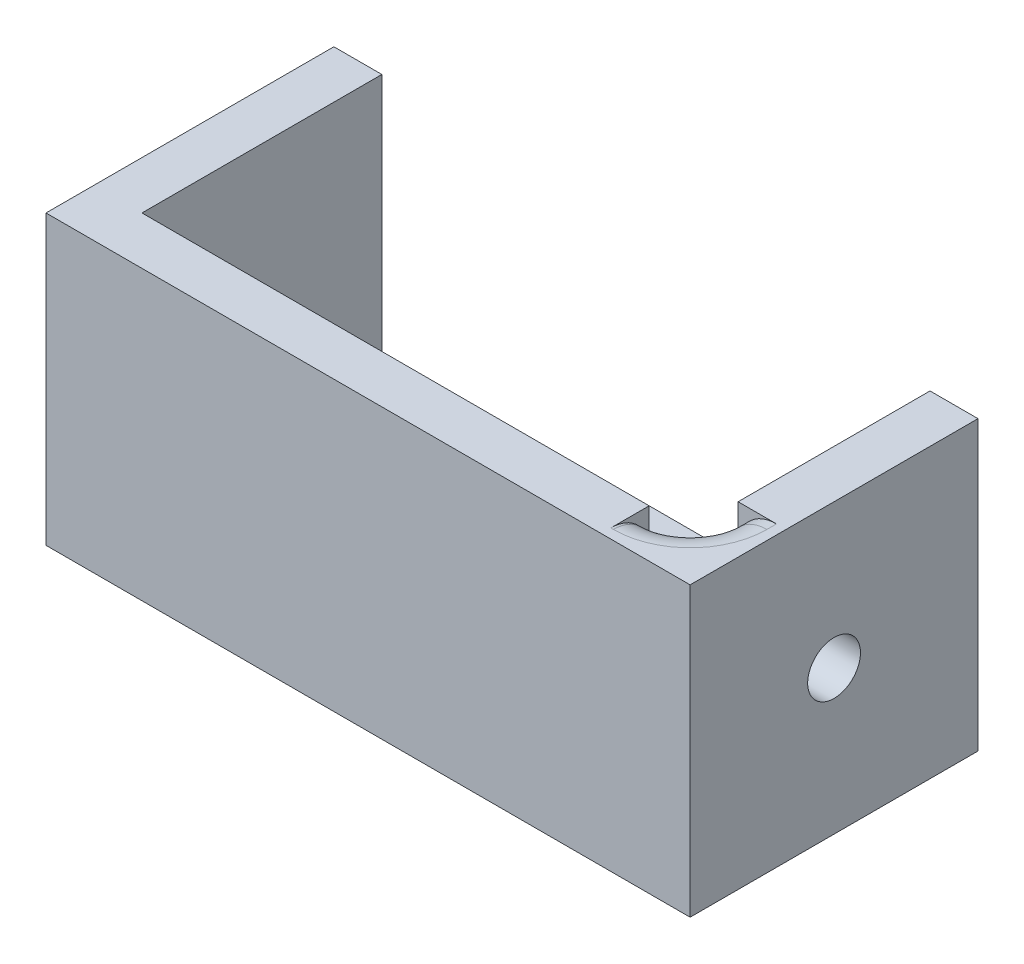
ISO-10303-21;
HEADER;
FILE_DESCRIPTION(('STEP AP214'),'2;1');
FILE_NAME('part.step','',(''),(''),'','','');
FILE_SCHEMA(('AUTOMOTIVE_DESIGN { 1 0 10303 214 1 1 1 1 }'));
ENDSEC;
DATA;
#1=APPLICATION_CONTEXT('core data for automotive mechanical design processes');
#2=APPLICATION_PROTOCOL_DEFINITION('international standard','automotive_design',2000,#1);
#3=PRODUCT_CONTEXT('',#1,'mechanical');
#4=PRODUCT('Part','Part','',(#3));
#5=PRODUCT_RELATED_PRODUCT_CATEGORY('part','',(#4));
#6=PRODUCT_DEFINITION_FORMATION('','',#4);
#7=PRODUCT_DEFINITION_CONTEXT('part definition',#1,'design');
#8=PRODUCT_DEFINITION('design','',#6,#7);
#9=PRODUCT_DEFINITION_SHAPE('','',#8);
#10=(LENGTH_UNIT() NAMED_UNIT(*) SI_UNIT(.MILLI.,.METRE.));
#11=(NAMED_UNIT(*) PLANE_ANGLE_UNIT() SI_UNIT($,.RADIAN.));
#12=(NAMED_UNIT(*) SI_UNIT($,.STERADIAN.) SOLID_ANGLE_UNIT());
#13=UNCERTAINTY_MEASURE_WITH_UNIT(LENGTH_MEASURE(1.E-05),#10,'distance_accuracy_value','');
#14=(GEOMETRIC_REPRESENTATION_CONTEXT(3) GLOBAL_UNCERTAINTY_ASSIGNED_CONTEXT((#13)) GLOBAL_UNIT_ASSIGNED_CONTEXT((#10,
#11,#12)) REPRESENTATION_CONTEXT('',''));
#15=CARTESIAN_POINT('',(0.,0.,0.));
#16=DIRECTION('',(0.,0.,1.));
#17=DIRECTION('',(1.,0.,0.));
#18=AXIS2_PLACEMENT_3D('',#15,#16,#17);
#19=CARTESIAN_POINT('',(-33.5625,15.,30.));
#20=DIRECTION('',(1.,0.,0.));
#21=DIRECTION('',(0.,0.,-1.));
#22=AXIS2_PLACEMENT_3D('',#19,#20,#21);
#23=PLANE('',#22);
#24=CARTESIAN_POINT('',(-33.5625,0.,15.));
#25=DIRECTION('',(1.,0.,0.));
#26=DIRECTION('',(0.,0.,-1.));
#27=AXIS2_PLACEMENT_3D('',#24,#25,#26);
#28=CIRCLE('',#27,2.75);
#29=CARTESIAN_POINT('',(-33.5625,0.,12.25));
#30=VERTEX_POINT('',#29);
#31=EDGE_CURVE('E272',#30,#30,#28,.T.);
#32=ORIENTED_EDGE('',*,*,#31,.T.);
#33=EDGE_LOOP('',(#32));
#34=FACE_BOUND('',#33,.T.);
#35=DIRECTION('',(0.,-1.,0.));
#36=VECTOR('',#35,1.);
#37=CARTESIAN_POINT('',(-33.5625,15.,0.));
#38=LINE('',#37,#36);
#39=CARTESIAN_POINT('',(-33.5625,15.,0.));
#40=VERTEX_POINT('',#39);
#41=CARTESIAN_POINT('',(-33.5625,-15.,0.));
#42=VERTEX_POINT('',#41);
#43=EDGE_CURVE('E219',#40,#42,#38,.T.);
#44=ORIENTED_EDGE('',*,*,#43,.T.);
#45=DIRECTION('',(0.,0.,-1.));
#46=VECTOR('',#45,1.);
#47=CARTESIAN_POINT('',(-33.5625,-15.,30.));
#48=LINE('',#47,#46);
#49=CARTESIAN_POINT('',(-33.5625,-15.,30.));
#50=VERTEX_POINT('',#49);
#51=EDGE_CURVE('E263',#50,#42,#48,.T.);
#52=ORIENTED_EDGE('',*,*,#51,.F.);
#53=DIRECTION('',(0.,-1.,0.));
#54=VECTOR('',#53,1.);
#55=CARTESIAN_POINT('',(-33.5625,15.,30.));
#56=LINE('',#55,#54);
#57=CARTESIAN_POINT('',(-33.5625,15.,30.));
#58=VERTEX_POINT('',#57);
#59=EDGE_CURVE('E224',#58,#50,#56,.T.);
#60=ORIENTED_EDGE('',*,*,#59,.F.);
#61=DIRECTION('',(0.,0.,-1.));
#62=VECTOR('',#61,1.);
#63=CARTESIAN_POINT('',(-33.5625,15.,30.));
#64=LINE('',#63,#62);
#65=EDGE_CURVE('E238',#58,#40,#64,.T.);
#66=ORIENTED_EDGE('',*,*,#65,.T.);
#67=EDGE_LOOP('',(#44,#52,#60,#66));
#68=FACE_BOUND('',#67,.T.);
#69=ADVANCED_FACE('F45',(#34,#68),#23,.F.);
#70=CARTESIAN_POINT('',(33.5625,-15.,30.));
#71=DIRECTION('',(0.,1.,0.));
#72=DIRECTION('',(0.,0.,1.));
#73=AXIS2_PLACEMENT_3D('',#70,#71,#72);
#74=PLANE('',#73);
#75=DIRECTION('',(1.,0.,0.));
#76=VECTOR('',#75,1.);
#77=CARTESIAN_POINT('',(33.5625,-15.,0.));
#78=LINE('',#77,#76);
#79=CARTESIAN_POINT('',(33.5625,-15.,0.));
#80=VERTEX_POINT('',#79);
#81=EDGE_CURVE('E242',#42,#80,#78,.T.);
#82=ORIENTED_EDGE('',*,*,#81,.T.);
#83=DIRECTION('',(0.,0.,-1.));
#84=VECTOR('',#83,1.);
#85=CARTESIAN_POINT('',(33.5625,-15.,30.));
#86=LINE('',#85,#84);
#87=CARTESIAN_POINT('',(33.5625,-15.,30.));
#88=VERTEX_POINT('',#87);
#89=EDGE_CURVE('E259',#88,#80,#86,.T.);
#90=ORIENTED_EDGE('',*,*,#89,.F.);
#91=DIRECTION('',(1.,0.,0.));
#92=VECTOR('',#91,1.);
#93=CARTESIAN_POINT('',(33.5625,-15.,30.));
#94=LINE('',#93,#92);
#95=EDGE_CURVE('E228',#50,#88,#94,.T.);
#96=ORIENTED_EDGE('',*,*,#95,.F.);
#97=ORIENTED_EDGE('',*,*,#51,.T.);
#98=EDGE_LOOP('',(#82,#90,#96,#97));
#99=FACE_BOUND('',#98,.T.);
#100=ADVANCED_FACE('F399',(#99),#74,.F.);
#101=CARTESIAN_POINT('',(33.5625,15.,30.));
#102=DIRECTION('',(-1.,0.,0.));
#103=DIRECTION('',(0.,0.,1.));
#104=AXIS2_PLACEMENT_3D('',#101,#102,#103);
#105=PLANE('',#104);
#106=CARTESIAN_POINT('',(33.5625,0.,15.));
#107=DIRECTION('',(1.,0.,0.));
#108=DIRECTION('',(0.,0.,-1.));
#109=AXIS2_PLACEMENT_3D('',#106,#107,#108);
#110=CIRCLE('',#109,2.75);
#111=CARTESIAN_POINT('',(33.5625,0.,12.25));
#112=VERTEX_POINT('',#111);
#113=EDGE_CURVE('E337',#112,#112,#110,.T.);
#114=ORIENTED_EDGE('',*,*,#113,.F.);
#115=EDGE_LOOP('',(#114));
#116=FACE_BOUND('',#115,.T.);
#117=DIRECTION('',(0.,1.,0.));
#118=VECTOR('',#117,1.);
#119=CARTESIAN_POINT('',(33.5625,15.,0.));
#120=LINE('',#119,#118);
#121=CARTESIAN_POINT('',(33.5625,15.,0.));
#122=VERTEX_POINT('',#121);
#123=EDGE_CURVE('E245',#80,#122,#120,.T.);
#124=ORIENTED_EDGE('',*,*,#123,.T.);
#125=DIRECTION('',(0.,0.,-1.));
#126=VECTOR('',#125,1.);
#127=CARTESIAN_POINT('',(33.5625,15.,30.));
#128=LINE('',#127,#126);
#129=CARTESIAN_POINT('',(33.5625,15.,30.));
#130=VERTEX_POINT('',#129);
#131=EDGE_CURVE('E255',#130,#122,#128,.T.);
#132=ORIENTED_EDGE('',*,*,#131,.F.);
#133=DIRECTION('',(0.,1.,0.));
#134=VECTOR('',#133,1.);
#135=CARTESIAN_POINT('',(33.5625,15.,30.));
#136=LINE('',#135,#134);
#137=EDGE_CURVE('E232',#88,#130,#136,.T.);
#138=ORIENTED_EDGE('',*,*,#137,.F.);
#139=ORIENTED_EDGE('',*,*,#89,.T.);
#140=EDGE_LOOP('',(#124,#132,#138,#139));
#141=FACE_BOUND('',#140,.T.);
#142=ADVANCED_FACE('F405',(#116,#141),#105,.F.);
#143=CARTESIAN_POINT('',(33.5625,15.,30.));
#144=DIRECTION('',(0.,-1.,0.));
#145=DIRECTION('',(0.,0.,-1.));
#146=AXIS2_PLACEMENT_3D('',#143,#144,#145);
#147=PLANE('',#146);
#148=DIRECTION('',(0.,0.,-1.));
#149=VECTOR('',#148,1.);
#150=CARTESIAN_POINT('',(28.5625,15.,25.));
#151=LINE('',#150,#149);
#152=CARTESIAN_POINT('',(28.5625,15.,20.));
#153=VERTEX_POINT('',#152);
#154=CARTESIAN_POINT('',(28.5625,15.,0.));
#155=VERTEX_POINT('',#154);
#156=EDGE_CURVE('E216',#153,#155,#151,.T.);
#157=ORIENTED_EDGE('',*,*,#156,.F.);
#158=DIRECTION('',(1.,0.,0.));
#159=VECTOR('',#158,1.);
#160=CARTESIAN_POINT('',(32.5625,15.,20.));
#161=LINE('',#160,#159);
#162=CARTESIAN_POINT('',(32.5625,15.,20.));
#163=VERTEX_POINT('',#162);
#164=EDGE_CURVE('E297',#153,#163,#161,.T.);
#165=ORIENTED_EDGE('',*,*,#164,.T.);
#166=DIRECTION('',(0.,0.,-1.));
#167=VECTOR('',#166,1.);
#168=CARTESIAN_POINT('',(32.5625,15.,30.));
#169=LINE('',#168,#167);
#170=CARTESIAN_POINT('',(32.5625,15.,21.));
#171=VERTEX_POINT('',#170);
#172=EDGE_CURVE('E294',#163,#171,#169,.F.);
#173=ORIENTED_EDGE('',*,*,#172,.T.);
#174=CARTESIAN_POINT('',(24.5625,15.,21.));
#175=DIRECTION('',(0.,-1.,0.));
#176=DIRECTION('',(0.,0.,-1.));
#177=AXIS2_PLACEMENT_3D('',#174,#175,#176);
#178=CIRCLE('',#177,8.);
#179=CARTESIAN_POINT('',(24.5625,15.,29.));
#180=VERTEX_POINT('',#179);
#181=EDGE_CURVE('E290',#180,#171,#178,.F.);
#182=ORIENTED_EDGE('',*,*,#181,.F.);
#183=DIRECTION('',(1.,0.,0.));
#184=VECTOR('',#183,1.);
#185=CARTESIAN_POINT('',(-28.5625,15.,29.));
#186=LINE('',#185,#184);
#187=CARTESIAN_POINT('',(24.29375,15.,29.));
#188=VERTEX_POINT('',#187);
#189=EDGE_CURVE('E287',#180,#188,#186,.F.);
#190=ORIENTED_EDGE('',*,*,#189,.T.);
#191=DIRECTION('',(0.,0.,-1.));
#192=VECTOR('',#191,1.);
#193=CARTESIAN_POINT('',(24.29375,15.,29.));
#194=LINE('',#193,#192);
#195=CARTESIAN_POINT('',(24.29375,15.,25.));
#196=VERTEX_POINT('',#195);
#197=EDGE_CURVE('E284',#188,#196,#194,.T.);
#198=ORIENTED_EDGE('',*,*,#197,.T.);
#199=DIRECTION('',(1.,0.,0.));
#200=VECTOR('',#199,1.);
#201=CARTESIAN_POINT('',(28.5625,15.,25.));
#202=LINE('',#201,#200);
#203=CARTESIAN_POINT('',(-28.5625,15.,25.));
#204=VERTEX_POINT('',#203);
#205=EDGE_CURVE('E200',#204,#196,#202,.T.);
#206=ORIENTED_EDGE('',*,*,#205,.F.);
#207=DIRECTION('',(0.,0.,-1.));
#208=VECTOR('',#207,1.);
#209=CARTESIAN_POINT('',(-28.5625,15.,25.));
#210=LINE('',#209,#208);
#211=CARTESIAN_POINT('',(-28.5625,15.,0.));
#212=VERTEX_POINT('',#211);
#213=EDGE_CURVE('E194',#204,#212,#210,.T.);
#214=ORIENTED_EDGE('',*,*,#213,.T.);
#215=DIRECTION('',(-1.,0.,0.));
#216=VECTOR('',#215,1.);
#217=CARTESIAN_POINT('',(33.5625,15.,0.));
#218=LINE('',#217,#216);
#219=EDGE_CURVE('E248',#212,#40,#218,.T.);
#220=ORIENTED_EDGE('',*,*,#219,.T.);
#221=ORIENTED_EDGE('',*,*,#65,.F.);
#222=DIRECTION('',(-1.,0.,0.));
#223=VECTOR('',#222,1.);
#224=CARTESIAN_POINT('',(33.5625,15.,30.));
#225=LINE('',#224,#223);
#226=EDGE_CURVE('E235',#130,#58,#225,.T.);
#227=ORIENTED_EDGE('',*,*,#226,.F.);
#228=ORIENTED_EDGE('',*,*,#131,.T.);
#229=EDGE_CURVE('E229',#122,#155,#218,.T.);
#230=ORIENTED_EDGE('',*,*,#229,.T.);
#231=EDGE_LOOP('',(#157,#165,#173,#182,#190,#198,#206,#214,#220,#221,#227,#228,#230));
#232=FACE_BOUND('',#231,.T.);
#233=ADVANCED_FACE('F633',(#232),#147,.F.);
#234=CARTESIAN_POINT('',(0.,0.,30.));
#235=DIRECTION('',(0.,0.,-1.));
#236=DIRECTION('',(-1.,0.,0.));
#237=AXIS2_PLACEMENT_3D('',#234,#235,#236);
#238=PLANE('',#237);
#239=ORIENTED_EDGE('',*,*,#59,.T.);
#240=ORIENTED_EDGE('',*,*,#95,.T.);
#241=ORIENTED_EDGE('',*,*,#137,.T.);
#242=ORIENTED_EDGE('',*,*,#226,.T.);
#243=EDGE_LOOP('',(#239,#240,#241,#242));
#244=FACE_BOUND('',#243,.T.);
#245=ADVANCED_FACE('F622',(#244),#238,.F.);
#246=CARTESIAN_POINT('',(0.,0.,0.));
#247=DIRECTION('',(0.,0.,-1.));
#248=DIRECTION('',(-1.,0.,0.));
#249=AXIS2_PLACEMENT_3D('',#246,#247,#248);
#250=PLANE('',#249);
#251=DIRECTION('',(0.,-1.,0.));
#252=VECTOR('',#251,1.);
#253=CARTESIAN_POINT('',(28.5625,15.,0.));
#254=LINE('',#253,#252);
#255=CARTESIAN_POINT('',(28.5625,-10.,0.));
#256=VERTEX_POINT('',#255);
#257=EDGE_CURVE('E206',#155,#256,#254,.T.);
#258=ORIENTED_EDGE('',*,*,#257,.F.);
#259=ORIENTED_EDGE('',*,*,#229,.F.);
#260=ORIENTED_EDGE('',*,*,#123,.F.);
#261=ORIENTED_EDGE('',*,*,#81,.F.);
#262=ORIENTED_EDGE('',*,*,#43,.F.);
#263=ORIENTED_EDGE('',*,*,#219,.F.);
#264=DIRECTION('',(0.,1.,0.));
#265=VECTOR('',#264,1.);
#266=CARTESIAN_POINT('',(-28.5625,15.,0.));
#267=LINE('',#266,#265);
#268=CARTESIAN_POINT('',(-28.5625,-10.,0.));
#269=VERTEX_POINT('',#268);
#270=EDGE_CURVE('E213',#269,#212,#267,.T.);
#271=ORIENTED_EDGE('',*,*,#270,.F.);
#272=DIRECTION('',(-1.,0.,0.));
#273=VECTOR('',#272,1.);
#274=CARTESIAN_POINT('',(28.5625,-10.,0.));
#275=LINE('',#274,#273);
#276=EDGE_CURVE('E190',#256,#269,#275,.T.);
#277=ORIENTED_EDGE('',*,*,#276,.F.);
#278=EDGE_LOOP('',(#258,#259,#260,#261,#262,#263,#271,#277));
#279=FACE_BOUND('',#278,.T.);
#280=ADVANCED_FACE('F611',(#279),#250,.T.);
#281=CARTESIAN_POINT('',(28.5625,15.,25.));
#282=DIRECTION('',(1.,0.,0.));
#283=DIRECTION('',(0.,1.,0.));
#284=AXIS2_PLACEMENT_3D('',#281,#282,#283);
#285=PLANE('',#284);
#286=CARTESIAN_POINT('',(28.5625,0.,15.));
#287=DIRECTION('',(1.,0.,0.));
#288=DIRECTION('',(0.,1.,0.));
#289=AXIS2_PLACEMENT_3D('',#286,#287,#288);
#290=CIRCLE('',#289,2.75);
#291=CARTESIAN_POINT('',(28.5625,2.75,15.));
#292=VERTEX_POINT('',#291);
#293=EDGE_CURVE('E210',#292,#292,#290,.T.);
#294=ORIENTED_EDGE('',*,*,#293,.T.);
#295=EDGE_LOOP('',(#294));
#296=FACE_BOUND('',#295,.T.);
#297=DIRECTION('',(0.,0.,-1.));
#298=VECTOR('',#297,1.);
#299=CARTESIAN_POINT('',(28.5625,-6.,25.));
#300=LINE('',#299,#298);
#301=CARTESIAN_POINT('',(28.5625,-6.,20.));
#302=VERTEX_POINT('',#301);
#303=CARTESIAN_POINT('',(28.5625,-6.,21.));
#304=VERTEX_POINT('',#303);
#305=EDGE_CURVE('E347',#302,#304,#300,.F.);
#306=ORIENTED_EDGE('',*,*,#305,.T.);
#307=DIRECTION('',(0.,0.,1.));
#308=VECTOR('',#307,1.);
#309=CARTESIAN_POINT('',(28.5625,-5.99999999999998,21.));
#310=LINE('',#309,#308);
#311=CARTESIAN_POINT('',(28.5625,-5.99999999999997,25.));
#312=VERTEX_POINT('',#311);
#313=EDGE_CURVE('E353',#304,#312,#310,.T.);
#314=ORIENTED_EDGE('',*,*,#313,.T.);
#315=DIRECTION('',(0.,-1.,0.));
#316=VECTOR('',#315,1.);
#317=CARTESIAN_POINT('',(28.5625,15.,25.));
#318=LINE('',#317,#316);
#319=CARTESIAN_POINT('',(28.5625,10.,25.));
#320=VERTEX_POINT('',#319);
#321=EDGE_CURVE('E184',#320,#312,#318,.T.);
#322=ORIENTED_EDGE('',*,*,#321,.F.);
#323=DIRECTION('',(0.,0.,-1.));
#324=VECTOR('',#323,1.);
#325=CARTESIAN_POINT('',(28.5625,10.,21.));
#326=LINE('',#325,#324);
#327=CARTESIAN_POINT('',(28.5625,10.,21.));
#328=VERTEX_POINT('',#327);
#329=EDGE_CURVE('E275',#320,#328,#326,.T.);
#330=ORIENTED_EDGE('',*,*,#329,.T.);
#331=DIRECTION('',(0.,-1.,0.));
#332=VECTOR('',#331,1.);
#333=CARTESIAN_POINT('',(28.5625,15.,21.));
#334=LINE('',#333,#332);
#335=CARTESIAN_POINT('',(28.5625,11.,21.));
#336=VERTEX_POINT('',#335);
#337=EDGE_CURVE('E267',#328,#336,#334,.F.);
#338=ORIENTED_EDGE('',*,*,#337,.T.);
#339=DIRECTION('',(0.,0.,-1.));
#340=VECTOR('',#339,1.);
#341=CARTESIAN_POINT('',(28.5625,11.,25.));
#342=LINE('',#341,#340);
#343=CARTESIAN_POINT('',(28.5625,11.,20.));
#344=VERTEX_POINT('',#343);
#345=EDGE_CURVE('E278',#336,#344,#342,.T.);
#346=ORIENTED_EDGE('',*,*,#345,.T.);
#347=DIRECTION('',(0.,1.,0.));
#348=VECTOR('',#347,1.);
#349=CARTESIAN_POINT('',(28.5625,11.,20.));
#350=LINE('',#349,#348);
#351=EDGE_CURVE('E281',#344,#153,#350,.T.);
#352=ORIENTED_EDGE('',*,*,#351,.T.);
#353=ORIENTED_EDGE('',*,*,#156,.T.);
#354=ORIENTED_EDGE('',*,*,#257,.T.);
#355=DIRECTION('',(0.,0.,-1.));
#356=VECTOR('',#355,1.);
#357=CARTESIAN_POINT('',(28.5625,-10.,25.));
#358=LINE('',#357,#356);
#359=CARTESIAN_POINT('',(28.5625,-10.,20.));
#360=VERTEX_POINT('',#359);
#361=EDGE_CURVE('E195',#360,#256,#358,.T.);
#362=ORIENTED_EDGE('',*,*,#361,.F.);
#363=DIRECTION('',(0.,1.,0.));
#364=VECTOR('',#363,1.);
#365=CARTESIAN_POINT('',(28.5625,-6.,20.));
#366=LINE('',#365,#364);
#367=EDGE_CURVE('E350',#360,#302,#366,.T.);
#368=ORIENTED_EDGE('',*,*,#367,.T.);
#369=EDGE_LOOP('',(#306,#314,#322,#330,#338,#346,#352,#353,#354,#362,#368));
#370=FACE_BOUND('',#369,.T.);
#371=ADVANCED_FACE('F600',(#296,#370),#285,.F.);
#372=CARTESIAN_POINT('',(-28.5625,15.,25.));
#373=DIRECTION('',(-1.,0.,0.));
#374=DIRECTION('',(0.,-1.,0.));
#375=AXIS2_PLACEMENT_3D('',#372,#373,#374);
#376=PLANE('',#375);
#377=CARTESIAN_POINT('',(-28.5625,0.,15.));
#378=DIRECTION('',(-1.,0.,0.));
#379=DIRECTION('',(0.,-1.,0.));
#380=AXIS2_PLACEMENT_3D('',#377,#378,#379);
#381=CIRCLE('',#380,2.75);
#382=CARTESIAN_POINT('',(-28.5625,-2.75,15.));
#383=VERTEX_POINT('',#382);
#384=EDGE_CURVE('E268',#383,#383,#381,.T.);
#385=ORIENTED_EDGE('',*,*,#384,.T.);
#386=EDGE_LOOP('',(#385));
#387=FACE_BOUND('',#386,.T.);
#388=ORIENTED_EDGE('',*,*,#270,.T.);
#389=ORIENTED_EDGE('',*,*,#213,.F.);
#390=DIRECTION('',(0.,1.,0.));
#391=VECTOR('',#390,1.);
#392=CARTESIAN_POINT('',(-28.5625,15.,25.));
#393=LINE('',#392,#391);
#394=CARTESIAN_POINT('',(-28.5625,-10.,25.));
#395=VERTEX_POINT('',#394);
#396=EDGE_CURVE('E178',#395,#204,#393,.T.);
#397=ORIENTED_EDGE('',*,*,#396,.F.);
#398=DIRECTION('',(0.,0.,-1.));
#399=VECTOR('',#398,1.);
#400=CARTESIAN_POINT('',(-28.5625,-10.,25.));
#401=LINE('',#400,#399);
#402=EDGE_CURVE('E187',#395,#269,#401,.T.);
#403=ORIENTED_EDGE('',*,*,#402,.T.);
#404=EDGE_LOOP('',(#388,#389,#397,#403));
#405=FACE_BOUND('',#404,.T.);
#406=ADVANCED_FACE('F197',(#387,#405),#376,.F.);
#407=CARTESIAN_POINT('',(28.5625,-10.,25.));
#408=DIRECTION('',(0.,-1.,0.));
#409=DIRECTION('',(0.,0.,-1.));
#410=AXIS2_PLACEMENT_3D('',#407,#408,#409);
#411=PLANE('',#410);
#412=DIRECTION('',(0.,0.,-1.));
#413=VECTOR('',#412,1.);
#414=CARTESIAN_POINT('',(24.5625,-10.,0.));
#415=LINE('',#414,#413);
#416=CARTESIAN_POINT('',(24.5625,-10.,21.));
#417=VERTEX_POINT('',#416);
#418=CARTESIAN_POINT('',(24.5625,-10.,20.));
#419=VERTEX_POINT('',#418);
#420=EDGE_CURVE('E55',#417,#419,#415,.T.);
#421=ORIENTED_EDGE('',*,*,#420,.T.);
#422=DIRECTION('',(1.,0.,0.));
#423=VECTOR('',#422,1.);
#424=CARTESIAN_POINT('',(24.5625,-10.,20.));
#425=LINE('',#424,#423);
#426=EDGE_CURVE('E11',#419,#360,#425,.T.);
#427=ORIENTED_EDGE('',*,*,#426,.T.);
#428=ORIENTED_EDGE('',*,*,#361,.T.);
#429=ORIENTED_EDGE('',*,*,#276,.T.);
#430=ORIENTED_EDGE('',*,*,#402,.F.);
#431=DIRECTION('',(-1.,0.,0.));
#432=VECTOR('',#431,1.);
#433=CARTESIAN_POINT('',(28.5625,-10.,25.));
#434=LINE('',#433,#432);
#435=CARTESIAN_POINT('',(23.9925,-10.,25.));
#436=VERTEX_POINT('',#435);
#437=EDGE_CURVE('E172',#436,#395,#434,.T.);
#438=ORIENTED_EDGE('',*,*,#437,.F.);
#439=DIRECTION('',(0.,0.,-1.));
#440=VECTOR('',#439,1.);
#441=CARTESIAN_POINT('',(23.9925,-10.,21.));
#442=LINE('',#441,#440);
#443=CARTESIAN_POINT('',(23.9925,-10.,21.));
#444=VERTEX_POINT('',#443);
#445=EDGE_CURVE('E358',#436,#444,#442,.T.);
#446=ORIENTED_EDGE('',*,*,#445,.T.);
#447=DIRECTION('',(-1.,0.,0.));
#448=VECTOR('',#447,1.);
#449=CARTESIAN_POINT('',(28.5625,-10.,21.));
#450=LINE('',#449,#448);
#451=EDGE_CURVE('E66',#444,#417,#450,.F.);
#452=ORIENTED_EDGE('',*,*,#451,.T.);
#453=EDGE_LOOP('',(#421,#427,#428,#429,#430,#438,#446,#452));
#454=FACE_BOUND('',#453,.T.);
#455=ADVANCED_FACE('F188',(#454),#411,.F.);
#456=CARTESIAN_POINT('',(0.,0.,25.));
#457=DIRECTION('',(0.,0.,-1.));
#458=DIRECTION('',(-1.,0.,0.));
#459=AXIS2_PLACEMENT_3D('',#456,#457,#458);
#460=PLANE('',#459);
#461=ORIENTED_EDGE('',*,*,#321,.T.);
#462=DIRECTION('',(-1.,0.,0.));
#463=VECTOR('',#462,1.);
#464=CARTESIAN_POINT('',(0.,-5.99999999999998,25.));
#465=LINE('',#464,#463);
#466=CARTESIAN_POINT('',(24.5625,-6.,25.));
#467=VERTEX_POINT('',#466);
#468=EDGE_CURVE('E343',#312,#467,#465,.T.);
#469=ORIENTED_EDGE('',*,*,#468,.T.);
#470=DIRECTION('',(-1.,0.,0.));
#471=VECTOR('',#470,1.);
#472=CARTESIAN_POINT('',(0.,-6.,25.));
#473=LINE('',#472,#471);
#474=CARTESIAN_POINT('',(23.9925,-6.,25.));
#475=VERTEX_POINT('',#474);
#476=EDGE_CURVE('E340',#467,#475,#473,.T.);
#477=ORIENTED_EDGE('',*,*,#476,.T.);
#478=DIRECTION('',(0.,-1.,0.));
#479=VECTOR('',#478,1.);
#480=CARTESIAN_POINT('',(23.9925,0.,25.));
#481=LINE('',#480,#479);
#482=EDGE_CURVE('E181',#475,#436,#481,.T.);
#483=ORIENTED_EDGE('',*,*,#482,.T.);
#484=ORIENTED_EDGE('',*,*,#437,.T.);
#485=ORIENTED_EDGE('',*,*,#396,.T.);
#486=ORIENTED_EDGE('',*,*,#205,.T.);
#487=DIRECTION('',(0.,-1.,0.));
#488=VECTOR('',#487,1.);
#489=CARTESIAN_POINT('',(24.29375,0.,25.));
#490=LINE('',#489,#488);
#491=CARTESIAN_POINT('',(24.29375,11.,25.));
#492=VERTEX_POINT('',#491);
#493=EDGE_CURVE('E309',#196,#492,#490,.T.);
#494=ORIENTED_EDGE('',*,*,#493,.T.);
#495=DIRECTION('',(1.,0.,0.));
#496=VECTOR('',#495,1.);
#497=CARTESIAN_POINT('',(28.5625,11.,25.));
#498=LINE('',#497,#496);
#499=CARTESIAN_POINT('',(24.5625,11.,25.));
#500=VERTEX_POINT('',#499);
#501=EDGE_CURVE('E306',#492,#500,#498,.T.);
#502=ORIENTED_EDGE('',*,*,#501,.T.);
#503=DIRECTION('',(0.,-1.,0.));
#504=VECTOR('',#503,1.);
#505=CARTESIAN_POINT('',(24.5625,0.,25.));
#506=LINE('',#505,#504);
#507=CARTESIAN_POINT('',(24.5625,10.,25.));
#508=VERTEX_POINT('',#507);
#509=EDGE_CURVE('E303',#500,#508,#506,.T.);
#510=ORIENTED_EDGE('',*,*,#509,.T.);
#511=DIRECTION('',(1.,0.,0.));
#512=VECTOR('',#511,1.);
#513=CARTESIAN_POINT('',(0.,10.,25.));
#514=LINE('',#513,#512);
#515=EDGE_CURVE('E300',#508,#320,#514,.T.);
#516=ORIENTED_EDGE('',*,*,#515,.T.);
#517=EDGE_LOOP('',(#461,#469,#477,#483,#484,#485,#486,#494,#502,#510,#516));
#518=FACE_BOUND('',#517,.T.);
#519=ADVANCED_FACE('F175',(#518),#460,.T.);
#520=CARTESIAN_POINT('',(-33.5625,0.,15.));
#521=DIRECTION('',(1.,0.,0.));
#522=DIRECTION('',(0.,0.,-1.));
#523=AXIS2_PLACEMENT_3D('',#520,#521,#522);
#524=CYLINDRICAL_SURFACE('',#523,2.75);
#525=ORIENTED_EDGE('',*,*,#31,.F.);
#526=EDGE_LOOP('',(#525));
#527=FACE_BOUND('',#526,.T.);
#528=ORIENTED_EDGE('',*,*,#384,.F.);
#529=EDGE_LOOP('',(#528));
#530=FACE_BOUND('',#529,.T.);
#531=ADVANCED_FACE('F563',(#527,#530),#524,.F.);
#532=ORIENTED_EDGE('',*,*,#113,.T.);
#533=EDGE_LOOP('',(#532));
#534=FACE_BOUND('',#533,.T.);
#535=ORIENTED_EDGE('',*,*,#293,.F.);
#536=EDGE_LOOP('',(#535));
#537=FACE_BOUND('',#536,.T.);
#538=ADVANCED_FACE('F434',(#534,#537),#524,.F.);
#539=CARTESIAN_POINT('',(24.29375,11.,29.));
#540=DIRECTION('',(1.,0.,0.));
#541=DIRECTION('',(0.,0.,-1.));
#542=AXIS2_PLACEMENT_3D('',#539,#540,#541);
#543=PLANE('',#542);
#544=ORIENTED_EDGE('',*,*,#493,.F.);
#545=ORIENTED_EDGE('',*,*,#197,.F.);
#546=CARTESIAN_POINT('',(24.29375,11.,29.));
#547=DIRECTION('',(-1.,0.,0.));
#548=DIRECTION('',(0.,0.,1.));
#549=AXIS2_PLACEMENT_3D('',#546,#547,#548);
#550=CIRCLE('',#549,4.);
#551=EDGE_CURVE('E333',#492,#188,#550,.F.);
#552=ORIENTED_EDGE('',*,*,#551,.F.);
#553=EDGE_LOOP('',(#544,#545,#552));
#554=FACE_BOUND('',#553,.T.);
#555=ADVANCED_FACE('F430',(#554),#543,.T.);
#556=CARTESIAN_POINT('',(24.5625,10.,21.));
#557=DIRECTION('',(0.,1.,0.));
#558=DIRECTION('',(-1.,0.,0.));
#559=AXIS2_PLACEMENT_3D('',#556,#557,#558);
#560=PLANE('',#559);
#561=ORIENTED_EDGE('',*,*,#329,.F.);
#562=ORIENTED_EDGE('',*,*,#515,.F.);
#563=CARTESIAN_POINT('',(24.5625,10.,21.));
#564=DIRECTION('',(0.,1.,0.));
#565=DIRECTION('',(0.,0.,1.));
#566=AXIS2_PLACEMENT_3D('',#563,#564,#565);
#567=CIRCLE('',#566,4.);
#568=EDGE_CURVE('E329',#328,#508,#567,.F.);
#569=ORIENTED_EDGE('',*,*,#568,.F.);
#570=EDGE_LOOP('',(#561,#562,#569));
#571=FACE_BOUND('',#570,.T.);
#572=ADVANCED_FACE('F426',(#571),#560,.F.);
#573=CARTESIAN_POINT('',(0.,11.,29.));
#574=DIRECTION('',(-1.,0.,0.));
#575=DIRECTION('',(0.,0.,1.));
#576=AXIS2_PLACEMENT_3D('',#573,#574,#575);
#577=CYLINDRICAL_SURFACE('',#576,4.);
#578=ORIENTED_EDGE('',*,*,#551,.T.);
#579=ORIENTED_EDGE('',*,*,#189,.F.);
#580=CARTESIAN_POINT('',(24.5625,11.,29.));
#581=DIRECTION('',(1.,0.,0.));
#582=DIRECTION('',(0.,0.,-1.));
#583=AXIS2_PLACEMENT_3D('',#580,#581,#582);
#584=CIRCLE('',#583,4.);
#585=EDGE_CURVE('E325',#500,#180,#584,.T.);
#586=ORIENTED_EDGE('',*,*,#585,.F.);
#587=ORIENTED_EDGE('',*,*,#501,.F.);
#588=EDGE_LOOP('',(#578,#579,#586,#587));
#589=FACE_BOUND('',#588,.T.);
#590=ADVANCED_FACE('F422',(#589),#577,.T.);
#591=CARTESIAN_POINT('',(24.5625,0.,21.));
#592=DIRECTION('',(0.,-1.,0.));
#593=DIRECTION('',(1.,0.,0.));
#594=AXIS2_PLACEMENT_3D('',#591,#592,#593);
#595=CYLINDRICAL_SURFACE('',#594,4.);
#596=ORIENTED_EDGE('',*,*,#568,.T.);
#597=ORIENTED_EDGE('',*,*,#509,.F.);
#598=CARTESIAN_POINT('',(24.5625,11.,21.));
#599=DIRECTION('',(0.,-1.,0.));
#600=DIRECTION('',(0.,0.,-1.));
#601=AXIS2_PLACEMENT_3D('',#598,#599,#600);
#602=CIRCLE('',#601,4.);
#603=EDGE_CURVE('E321',#336,#500,#602,.T.);
#604=ORIENTED_EDGE('',*,*,#603,.F.);
#605=ORIENTED_EDGE('',*,*,#337,.F.);
#606=EDGE_LOOP('',(#596,#597,#604,#605));
#607=FACE_BOUND('',#606,.T.);
#608=ADVANCED_FACE('F418',(#607),#595,.F.);
#609=CARTESIAN_POINT('',(24.5625,11.,21.));
#610=DIRECTION('',(0.,-1.,0.));
#611=DIRECTION('',(0.,0.,-1.));
#612=AXIS2_PLACEMENT_3D('',#609,#610,#611);
#613=TOROIDAL_SURFACE('',#612,8.,4.);
#614=ORIENTED_EDGE('',*,*,#585,.T.);
#615=ORIENTED_EDGE('',*,*,#181,.T.);
#616=CARTESIAN_POINT('',(32.5625,11.,21.));
#617=DIRECTION('',(0.,0.,1.));
#618=DIRECTION('',(1.,0.,0.));
#619=AXIS2_PLACEMENT_3D('',#616,#617,#618);
#620=CIRCLE('',#619,4.);
#621=EDGE_CURVE('E317',#336,#171,#620,.F.);
#622=ORIENTED_EDGE('',*,*,#621,.F.);
#623=ORIENTED_EDGE('',*,*,#603,.T.);
#624=EDGE_LOOP('',(#614,#615,#622,#623));
#625=FACE_BOUND('',#624,.T.);
#626=ADVANCED_FACE('F414',(#625),#613,.T.);
#627=CARTESIAN_POINT('',(32.5625,11.,20.));
#628=DIRECTION('',(0.,0.,1.));
#629=DIRECTION('',(1.,0.,0.));
#630=AXIS2_PLACEMENT_3D('',#627,#628,#629);
#631=PLANE('',#630);
#632=ORIENTED_EDGE('',*,*,#164,.F.);
#633=ORIENTED_EDGE('',*,*,#351,.F.);
#634=CARTESIAN_POINT('',(32.5625,11.,20.));
#635=DIRECTION('',(0.,0.,-1.));
#636=DIRECTION('',(-1.,0.,0.));
#637=AXIS2_PLACEMENT_3D('',#634,#635,#636);
#638=CIRCLE('',#637,4.);
#639=EDGE_CURVE('E313',#163,#344,#638,.F.);
#640=ORIENTED_EDGE('',*,*,#639,.F.);
#641=EDGE_LOOP('',(#632,#633,#640));
#642=FACE_BOUND('',#641,.T.);
#643=ADVANCED_FACE('F395',(#642),#631,.T.);
#644=CARTESIAN_POINT('',(32.5625,11.,25.));
#645=DIRECTION('',(0.,0.,-1.));
#646=DIRECTION('',(-1.,0.,0.));
#647=AXIS2_PLACEMENT_3D('',#644,#645,#646);
#648=CYLINDRICAL_SURFACE('',#647,4.);
#649=ORIENTED_EDGE('',*,*,#621,.T.);
#650=ORIENTED_EDGE('',*,*,#172,.F.);
#651=ORIENTED_EDGE('',*,*,#639,.T.);
#652=ORIENTED_EDGE('',*,*,#345,.F.);
#653=EDGE_LOOP('',(#649,#650,#651,#652));
#654=FACE_BOUND('',#653,.T.);
#655=ADVANCED_FACE('F389',(#654),#648,.T.);
#656=CARTESIAN_POINT('',(23.9925,-6.,21.));
#657=DIRECTION('',(1.,0.,0.));
#658=DIRECTION('',(0.,0.,-1.));
#659=AXIS2_PLACEMENT_3D('',#656,#657,#658);
#660=PLANE('',#659);
#661=ORIENTED_EDGE('',*,*,#445,.F.);
#662=ORIENTED_EDGE('',*,*,#482,.F.);
#663=CARTESIAN_POINT('',(23.9925,-6.,21.));
#664=DIRECTION('',(1.,0.,0.));
#665=DIRECTION('',(0.,0.,-1.));
#666=AXIS2_PLACEMENT_3D('',#663,#664,#665);
#667=CIRCLE('',#666,4.);
#668=EDGE_CURVE('E49',#444,#475,#667,.F.);
#669=ORIENTED_EDGE('',*,*,#668,.F.);
#670=EDGE_LOOP('',(#661,#662,#669));
#671=FACE_BOUND('',#670,.T.);
#672=ADVANCED_FACE('F47',(#671),#660,.F.);
#673=CARTESIAN_POINT('',(24.5625,-6.,20.));
#674=DIRECTION('',(0.,0.,1.));
#675=DIRECTION('',(1.,0.,0.));
#676=AXIS2_PLACEMENT_3D('',#673,#674,#675);
#677=PLANE('',#676);
#678=ORIENTED_EDGE('',*,*,#367,.F.);
#679=ORIENTED_EDGE('',*,*,#426,.F.);
#680=CARTESIAN_POINT('',(24.5625,-6.,20.));
#681=DIRECTION('',(0.,0.,1.));
#682=DIRECTION('',(1.,0.,0.));
#683=AXIS2_PLACEMENT_3D('',#680,#681,#682);
#684=CIRCLE('',#683,4.);
#685=EDGE_CURVE('E373',#302,#419,#684,.F.);
#686=ORIENTED_EDGE('',*,*,#685,.F.);
#687=EDGE_LOOP('',(#678,#679,#686));
#688=FACE_BOUND('',#687,.T.);
#689=ADVANCED_FACE('F388',(#688),#677,.F.);
#690=CARTESIAN_POINT('',(0.,-6.,21.));
#691=DIRECTION('',(-1.,0.,0.));
#692=DIRECTION('',(0.,0.,1.));
#693=AXIS2_PLACEMENT_3D('',#690,#691,#692);
#694=CYLINDRICAL_SURFACE('',#693,4.);
#695=ORIENTED_EDGE('',*,*,#668,.T.);
#696=ORIENTED_EDGE('',*,*,#476,.F.);
#697=CARTESIAN_POINT('',(24.5625,-6.,21.));
#698=DIRECTION('',(-1.,0.,0.));
#699=DIRECTION('',(0.,0.,1.));
#700=AXIS2_PLACEMENT_3D('',#697,#698,#699);
#701=CIRCLE('',#700,4.);
#702=EDGE_CURVE('E370',#417,#467,#701,.T.);
#703=ORIENTED_EDGE('',*,*,#702,.F.);
#704=ORIENTED_EDGE('',*,*,#451,.F.);
#705=EDGE_LOOP('',(#695,#696,#703,#704));
#706=FACE_BOUND('',#705,.T.);
#707=ADVANCED_FACE('F384',(#706),#694,.F.);
#708=CARTESIAN_POINT('',(24.5625,-6.,25.));
#709=DIRECTION('',(0.,0.,1.));
#710=DIRECTION('',(1.,0.,0.));
#711=AXIS2_PLACEMENT_3D('',#708,#709,#710);
#712=CYLINDRICAL_SURFACE('',#711,4.);
#713=ORIENTED_EDGE('',*,*,#685,.T.);
#714=ORIENTED_EDGE('',*,*,#420,.F.);
#715=CARTESIAN_POINT('',(24.5625,-6.,21.));
#716=DIRECTION('',(0.,0.,-1.));
#717=DIRECTION('',(-1.,0.,0.));
#718=AXIS2_PLACEMENT_3D('',#715,#716,#717);
#719=CIRCLE('',#718,4.);
#720=EDGE_CURVE('E366',#304,#417,#719,.T.);
#721=ORIENTED_EDGE('',*,*,#720,.F.);
#722=ORIENTED_EDGE('',*,*,#305,.F.);
#723=EDGE_LOOP('',(#713,#714,#721,#722));
#724=FACE_BOUND('',#723,.T.);
#725=ADVANCED_FACE('F443',(#724),#712,.F.);
#726=CARTESIAN_POINT('',(24.5625,-6.,21.));
#727=DIRECTION('',(0.,-1.,0.));
#728=DIRECTION('',(0.,0.,-1.));
#729=AXIS2_PLACEMENT_3D('',#726,#727,#728);
#730=SPHERICAL_SURFACE('',#729,4.);
#731=CARTESIAN_POINT('',(24.5625,-6.,21.));
#732=DIRECTION('',(0.,1.,0.));
#733=DIRECTION('',(-1.,0.,0.));
#734=AXIS2_PLACEMENT_3D('',#731,#732,#733);
#735=CIRCLE('',#734,4.);
#736=EDGE_CURVE('E363',#304,#467,#735,.F.);
#737=ORIENTED_EDGE('',*,*,#736,.F.);
#738=ORIENTED_EDGE('',*,*,#720,.T.);
#739=ORIENTED_EDGE('',*,*,#702,.T.);
#740=EDGE_LOOP('',(#737,#738,#739));
#741=FACE_BOUND('',#740,.T.);
#742=ADVANCED_FACE('F439',(#741),#730,.F.);
#743=CARTESIAN_POINT('',(24.5625,-5.99999999999998,21.));
#744=DIRECTION('',(0.,-1.,0.));
#745=DIRECTION('',(1.,0.,0.));
#746=AXIS2_PLACEMENT_3D('',#743,#744,#745);
#747=PLANE('',#746);
#748=ORIENTED_EDGE('',*,*,#468,.F.);
#749=ORIENTED_EDGE('',*,*,#313,.F.);
#750=ORIENTED_EDGE('',*,*,#736,.T.);
#751=EDGE_LOOP('',(#748,#749,#750));
#752=FACE_BOUND('',#751,.T.);
#753=ADVANCED_FACE('F436',(#752),#747,.F.);
#754=CLOSED_SHELL('',(#69,#100,#142,#233,#245,#280,#371,#406,#455,#519,#531,#538,#555,#572,#590,
#608,#626,#643,#655,#672,#689,#707,#725,#742,#753));
#755=MANIFOLD_SOLID_BREP('B2',#754);
#756=ADVANCED_BREP_SHAPE_REPRESENTATION('',(#18,#755),#14);
#757=SHAPE_DEFINITION_REPRESENTATION(#9,#756);
ENDSEC;
END-ISO-10303-21;
